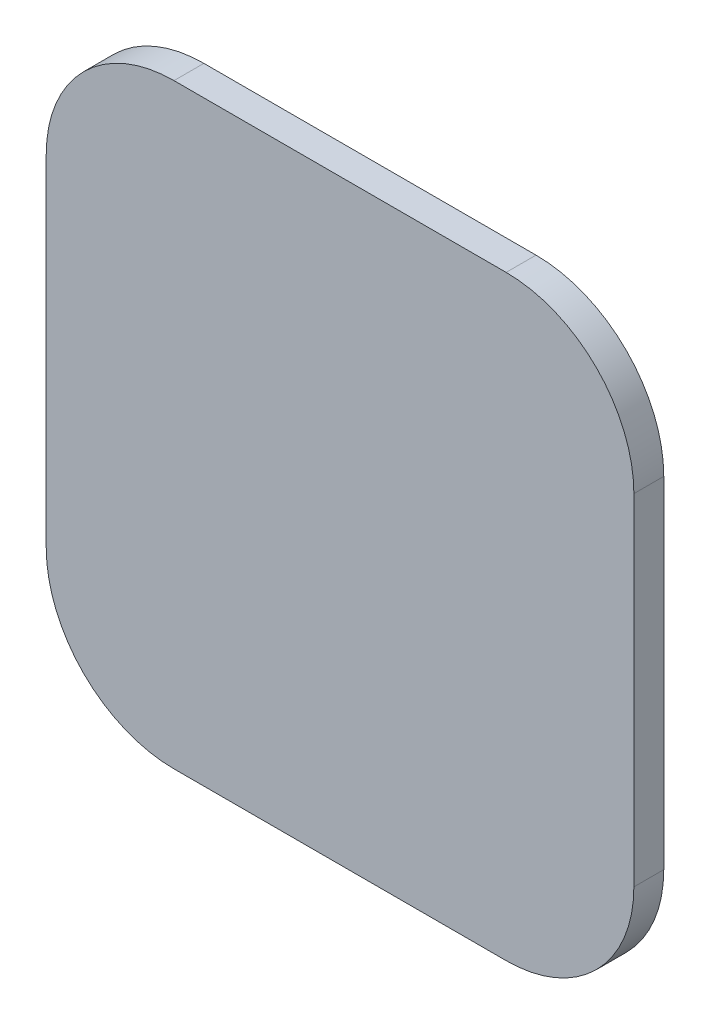
ISO-10303-21;
HEADER;
FILE_DESCRIPTION(('STEP AP214'),'2;1');
FILE_NAME('part.step','',(''),(''),'','','');
FILE_SCHEMA(('AUTOMOTIVE_DESIGN { 1 0 10303 214 1 1 1 1 }'));
ENDSEC;
DATA;
#1=APPLICATION_CONTEXT('core data for automotive mechanical design processes');
#2=APPLICATION_PROTOCOL_DEFINITION('international standard','automotive_design',2000,#1);
#3=PRODUCT_CONTEXT('',#1,'mechanical');
#4=PRODUCT('Part','Part','',(#3));
#5=PRODUCT_RELATED_PRODUCT_CATEGORY('part','',(#4));
#6=PRODUCT_DEFINITION_FORMATION('','',#4);
#7=PRODUCT_DEFINITION_CONTEXT('part definition',#1,'design');
#8=PRODUCT_DEFINITION('design','',#6,#7);
#9=PRODUCT_DEFINITION_SHAPE('','',#8);
#10=(LENGTH_UNIT() NAMED_UNIT(*) SI_UNIT(.MILLI.,.METRE.));
#11=(NAMED_UNIT(*) PLANE_ANGLE_UNIT() SI_UNIT($,.RADIAN.));
#12=(NAMED_UNIT(*) SI_UNIT($,.STERADIAN.) SOLID_ANGLE_UNIT());
#13=UNCERTAINTY_MEASURE_WITH_UNIT(LENGTH_MEASURE(1.E-05),#10,'distance_accuracy_value','');
#14=(GEOMETRIC_REPRESENTATION_CONTEXT(3) GLOBAL_UNCERTAINTY_ASSIGNED_CONTEXT((#13)) GLOBAL_UNIT_ASSIGNED_CONTEXT((#10,
#11,#12)) REPRESENTATION_CONTEXT('',''));
#15=CARTESIAN_POINT('',(0.,0.,0.));
#16=DIRECTION('',(0.,0.,1.));
#17=DIRECTION('',(1.,0.,0.));
#18=AXIS2_PLACEMENT_3D('',#15,#16,#17);
#19=CARTESIAN_POINT('',(0.,0.,-1.17));
#20=DIRECTION('',(-1.,0.,0.));
#21=DIRECTION('',(0.,0.,1.));
#22=AXIS2_PLACEMENT_3D('',#19,#20,#21);
#23=PLANE('',#22);
#24=DIRECTION('',(0.,-1.,0.));
#25=VECTOR('',#24,1.);
#26=CARTESIAN_POINT('',(0.,0.,0.));
#27=LINE('',#26,#25);
#28=CARTESIAN_POINT('',(0.,18.33,0.));
#29=VERTEX_POINT('',#28);
#30=CARTESIAN_POINT('',(0.,5.,0.));
#31=VERTEX_POINT('',#30);
#32=EDGE_CURVE('E162',#29,#31,#27,.T.);
#33=ORIENTED_EDGE('',*,*,#32,.F.);
#34=DIRECTION('',(0.,0.,1.));
#35=VECTOR('',#34,1.);
#36=CARTESIAN_POINT('',(0.,18.33,-1.17));
#37=LINE('',#36,#35);
#38=CARTESIAN_POINT('',(0.,18.33,-1.17));
#39=VERTEX_POINT('',#38);
#40=EDGE_CURVE('E142',#29,#39,#37,.F.);
#41=ORIENTED_EDGE('',*,*,#40,.T.);
#42=DIRECTION('',(0.,-1.,0.));
#43=VECTOR('',#42,1.);
#44=CARTESIAN_POINT('',(0.,0.,-1.17));
#45=LINE('',#44,#43);
#46=CARTESIAN_POINT('',(0.,5.,-1.17));
#47=VERTEX_POINT('',#46);
#48=EDGE_CURVE('E123',#39,#47,#45,.T.);
#49=ORIENTED_EDGE('',*,*,#48,.T.);
#50=DIRECTION('',(0.,0.,1.));
#51=VECTOR('',#50,1.);
#52=CARTESIAN_POINT('',(0.,5.,-1.17));
#53=LINE('',#52,#51);
#54=EDGE_CURVE('E139',#47,#31,#53,.T.);
#55=ORIENTED_EDGE('',*,*,#54,.T.);
#56=EDGE_LOOP('',(#33,#41,#49,#55));
#57=FACE_BOUND('',#56,.T.);
#58=ADVANCED_FACE('F37',(#57),#23,.T.);
#59=CARTESIAN_POINT('',(0.,23.33,-1.17));
#60=DIRECTION('',(0.,1.,0.));
#61=DIRECTION('',(-1.,0.,0.));
#62=AXIS2_PLACEMENT_3D('',#59,#60,#61);
#63=PLANE('',#62);
#64=DIRECTION('',(-1.,0.,0.));
#65=VECTOR('',#64,1.);
#66=CARTESIAN_POINT('',(0.,23.33,-1.17));
#67=LINE('',#66,#65);
#68=CARTESIAN_POINT('',(18.,23.33,-1.17));
#69=VERTEX_POINT('',#68);
#70=CARTESIAN_POINT('',(5.,23.33,-1.17));
#71=VERTEX_POINT('',#70);
#72=EDGE_CURVE('E127',#69,#71,#67,.T.);
#73=ORIENTED_EDGE('',*,*,#72,.T.);
#74=DIRECTION('',(0.,0.,1.));
#75=VECTOR('',#74,1.);
#76=CARTESIAN_POINT('',(5.,23.33,-1.17));
#77=LINE('',#76,#75);
#78=CARTESIAN_POINT('',(5.,23.33,0.));
#79=VERTEX_POINT('',#78);
#80=EDGE_CURVE('E114',#71,#79,#77,.T.);
#81=ORIENTED_EDGE('',*,*,#80,.T.);
#82=DIRECTION('',(-1.,0.,0.));
#83=VECTOR('',#82,1.);
#84=CARTESIAN_POINT('',(0.,23.33,0.));
#85=LINE('',#84,#83);
#86=CARTESIAN_POINT('',(18.,23.33,0.));
#87=VERTEX_POINT('',#86);
#88=EDGE_CURVE('E106',#87,#79,#85,.T.);
#89=ORIENTED_EDGE('',*,*,#88,.F.);
#90=DIRECTION('',(0.,0.,1.));
#91=VECTOR('',#90,1.);
#92=CARTESIAN_POINT('',(18.,23.33,-1.17));
#93=LINE('',#92,#91);
#94=EDGE_CURVE('E120',#87,#69,#93,.F.);
#95=ORIENTED_EDGE('',*,*,#94,.T.);
#96=EDGE_LOOP('',(#73,#81,#89,#95));
#97=FACE_BOUND('',#96,.T.);
#98=ADVANCED_FACE('F119',(#97),#63,.T.);
#99=CARTESIAN_POINT('',(23.,0.,-1.17));
#100=DIRECTION('',(1.,0.,0.));
#101=DIRECTION('',(0.,0.,-1.));
#102=AXIS2_PLACEMENT_3D('',#99,#100,#101);
#103=PLANE('',#102);
#104=DIRECTION('',(0.,1.,0.));
#105=VECTOR('',#104,1.);
#106=CARTESIAN_POINT('',(23.,0.,0.));
#107=LINE('',#106,#105);
#108=CARTESIAN_POINT('',(23.,5.,0.));
#109=VERTEX_POINT('',#108);
#110=CARTESIAN_POINT('',(23.,18.33,0.));
#111=VERTEX_POINT('',#110);
#112=EDGE_CURVE('E108',#109,#111,#107,.T.);
#113=ORIENTED_EDGE('',*,*,#112,.F.);
#114=DIRECTION('',(0.,0.,1.));
#115=VECTOR('',#114,1.);
#116=CARTESIAN_POINT('',(23.,5.,-1.17));
#117=LINE('',#116,#115);
#118=CARTESIAN_POINT('',(23.,5.,-1.17));
#119=VERTEX_POINT('',#118);
#120=EDGE_CURVE('E11',#109,#119,#117,.F.);
#121=ORIENTED_EDGE('',*,*,#120,.T.);
#122=DIRECTION('',(0.,1.,0.));
#123=VECTOR('',#122,1.);
#124=CARTESIAN_POINT('',(23.,0.,-1.17));
#125=LINE('',#124,#123);
#126=CARTESIAN_POINT('',(23.,18.33,-1.17));
#127=VERTEX_POINT('',#126);
#128=EDGE_CURVE('E130',#119,#127,#125,.T.);
#129=ORIENTED_EDGE('',*,*,#128,.T.);
#130=DIRECTION('',(0.,0.,1.));
#131=VECTOR('',#130,1.);
#132=CARTESIAN_POINT('',(23.,18.33,-1.17));
#133=LINE('',#132,#131);
#134=EDGE_CURVE('E45',#127,#111,#133,.T.);
#135=ORIENTED_EDGE('',*,*,#134,.T.);
#136=EDGE_LOOP('',(#113,#121,#129,#135));
#137=FACE_BOUND('',#136,.T.);
#138=ADVANCED_FACE('F155',(#137),#103,.T.);
#139=CARTESIAN_POINT('',(0.,0.,-1.17));
#140=DIRECTION('',(0.,-1.,0.));
#141=DIRECTION('',(0.,0.,-1.));
#142=AXIS2_PLACEMENT_3D('',#139,#140,#141);
#143=PLANE('',#142);
#144=DIRECTION('',(1.,0.,0.));
#145=VECTOR('',#144,1.);
#146=CARTESIAN_POINT('',(0.,0.,0.));
#147=LINE('',#146,#145);
#148=CARTESIAN_POINT('',(5.,0.,0.));
#149=VERTEX_POINT('',#148);
#150=CARTESIAN_POINT('',(18.,0.,0.));
#151=VERTEX_POINT('',#150);
#152=EDGE_CURVE('E165',#149,#151,#147,.T.);
#153=ORIENTED_EDGE('',*,*,#152,.F.);
#154=DIRECTION('',(0.,0.,1.));
#155=VECTOR('',#154,1.);
#156=CARTESIAN_POINT('',(5.,0.,-1.17));
#157=LINE('',#156,#155);
#158=CARTESIAN_POINT('',(5.,0.,-1.17));
#159=VERTEX_POINT('',#158);
#160=EDGE_CURVE('E59',#149,#159,#157,.F.);
#161=ORIENTED_EDGE('',*,*,#160,.T.);
#162=DIRECTION('',(1.,0.,0.));
#163=VECTOR('',#162,1.);
#164=CARTESIAN_POINT('',(0.,0.,-1.17));
#165=LINE('',#164,#163);
#166=CARTESIAN_POINT('',(18.,0.,-1.17));
#167=VERTEX_POINT('',#166);
#168=EDGE_CURVE('E157',#159,#167,#165,.T.);
#169=ORIENTED_EDGE('',*,*,#168,.T.);
#170=DIRECTION('',(0.,0.,1.));
#171=VECTOR('',#170,1.);
#172=CARTESIAN_POINT('',(18.,0.,-1.17));
#173=LINE('',#172,#171);
#174=EDGE_CURVE('E150',#167,#151,#173,.T.);
#175=ORIENTED_EDGE('',*,*,#174,.T.);
#176=EDGE_LOOP('',(#153,#161,#169,#175));
#177=FACE_BOUND('',#176,.T.);
#178=ADVANCED_FACE('F167',(#177),#143,.T.);
#179=CARTESIAN_POINT('',(0.,0.,-1.17));
#180=DIRECTION('',(0.,0.,-1.));
#181=DIRECTION('',(-1.,0.,0.));
#182=AXIS2_PLACEMENT_3D('',#179,#180,#181);
#183=PLANE('',#182);
#184=ORIENTED_EDGE('',*,*,#48,.F.);
#185=CARTESIAN_POINT('',(5.,18.33,-1.17));
#186=DIRECTION('',(0.,0.,-1.));
#187=DIRECTION('',(-1.,0.,0.));
#188=AXIS2_PLACEMENT_3D('',#185,#186,#187);
#189=CIRCLE('',#188,5.);
#190=EDGE_CURVE('E148',#39,#71,#189,.T.);
#191=ORIENTED_EDGE('',*,*,#190,.T.);
#192=ORIENTED_EDGE('',*,*,#72,.F.);
#193=CARTESIAN_POINT('',(18.,18.33,-1.17));
#194=DIRECTION('',(0.,0.,-1.));
#195=DIRECTION('',(-1.,0.,0.));
#196=AXIS2_PLACEMENT_3D('',#193,#194,#195);
#197=CIRCLE('',#196,5.);
#198=EDGE_CURVE('E126',#69,#127,#197,.T.);
#199=ORIENTED_EDGE('',*,*,#198,.T.);
#200=ORIENTED_EDGE('',*,*,#128,.F.);
#201=CARTESIAN_POINT('',(18.,5.,-1.17));
#202=DIRECTION('',(0.,0.,-1.));
#203=DIRECTION('',(-1.,0.,0.));
#204=AXIS2_PLACEMENT_3D('',#201,#202,#203);
#205=CIRCLE('',#204,5.);
#206=EDGE_CURVE('E52',#119,#167,#205,.T.);
#207=ORIENTED_EDGE('',*,*,#206,.T.);
#208=ORIENTED_EDGE('',*,*,#168,.F.);
#209=CARTESIAN_POINT('',(5.,5.,-1.17));
#210=DIRECTION('',(0.,0.,-1.));
#211=DIRECTION('',(-1.,0.,0.));
#212=AXIS2_PLACEMENT_3D('',#209,#210,#211);
#213=CIRCLE('',#212,5.);
#214=EDGE_CURVE('E146',#159,#47,#213,.T.);
#215=ORIENTED_EDGE('',*,*,#214,.T.);
#216=EDGE_LOOP('',(#184,#191,#192,#199,#200,#207,#208,#215));
#217=FACE_BOUND('',#216,.T.);
#218=ADVANCED_FACE('F175',(#217),#183,.T.);
#219=CARTESIAN_POINT('',(0.,0.,0.));
#220=DIRECTION('',(0.,0.,-1.));
#221=DIRECTION('',(-1.,0.,0.));
#222=AXIS2_PLACEMENT_3D('',#219,#220,#221);
#223=PLANE('',#222);
#224=ORIENTED_EDGE('',*,*,#88,.T.);
#225=CARTESIAN_POINT('',(5.,18.33,0.));
#226=DIRECTION('',(0.,0.,-1.));
#227=DIRECTION('',(-1.,0.,0.));
#228=AXIS2_PLACEMENT_3D('',#225,#226,#227);
#229=CIRCLE('',#228,5.);
#230=EDGE_CURVE('E137',#79,#29,#229,.F.);
#231=ORIENTED_EDGE('',*,*,#230,.T.);
#232=ORIENTED_EDGE('',*,*,#32,.T.);
#233=CARTESIAN_POINT('',(5.,5.,0.));
#234=DIRECTION('',(0.,0.,-1.));
#235=DIRECTION('',(-1.,0.,0.));
#236=AXIS2_PLACEMENT_3D('',#233,#234,#235);
#237=CIRCLE('',#236,5.);
#238=EDGE_CURVE('E135',#31,#149,#237,.F.);
#239=ORIENTED_EDGE('',*,*,#238,.T.);
#240=ORIENTED_EDGE('',*,*,#152,.T.);
#241=CARTESIAN_POINT('',(18.,5.,0.));
#242=DIRECTION('',(0.,0.,-1.));
#243=DIRECTION('',(-1.,0.,0.));
#244=AXIS2_PLACEMENT_3D('',#241,#242,#243);
#245=CIRCLE('',#244,5.);
#246=EDGE_CURVE('E113',#151,#109,#245,.F.);
#247=ORIENTED_EDGE('',*,*,#246,.T.);
#248=ORIENTED_EDGE('',*,*,#112,.T.);
#249=CARTESIAN_POINT('',(18.,18.33,0.));
#250=DIRECTION('',(0.,0.,-1.));
#251=DIRECTION('',(-1.,0.,0.));
#252=AXIS2_PLACEMENT_3D('',#249,#250,#251);
#253=CIRCLE('',#252,5.);
#254=EDGE_CURVE('E103',#111,#87,#253,.F.);
#255=ORIENTED_EDGE('',*,*,#254,.T.);
#256=EDGE_LOOP('',(#224,#231,#232,#239,#240,#247,#248,#255));
#257=FACE_BOUND('',#256,.T.);
#258=ADVANCED_FACE('F105',(#257),#223,.F.);
#259=CARTESIAN_POINT('',(5.,18.33,-1.17));
#260=DIRECTION('',(0.,0.,1.));
#261=DIRECTION('',(1.,0.,0.));
#262=AXIS2_PLACEMENT_3D('',#259,#260,#261);
#263=CYLINDRICAL_SURFACE('',#262,5.);
#264=ORIENTED_EDGE('',*,*,#190,.F.);
#265=ORIENTED_EDGE('',*,*,#40,.F.);
#266=ORIENTED_EDGE('',*,*,#230,.F.);
#267=ORIENTED_EDGE('',*,*,#80,.F.);
#268=EDGE_LOOP('',(#264,#265,#266,#267));
#269=FACE_BOUND('',#268,.T.);
#270=ADVANCED_FACE('F181',(#269),#263,.T.);
#271=CARTESIAN_POINT('',(5.,5.,-1.17));
#272=DIRECTION('',(0.,0.,1.));
#273=DIRECTION('',(1.,0.,0.));
#274=AXIS2_PLACEMENT_3D('',#271,#272,#273);
#275=CYLINDRICAL_SURFACE('',#274,5.);
#276=ORIENTED_EDGE('',*,*,#214,.F.);
#277=ORIENTED_EDGE('',*,*,#160,.F.);
#278=ORIENTED_EDGE('',*,*,#238,.F.);
#279=ORIENTED_EDGE('',*,*,#54,.F.);
#280=EDGE_LOOP('',(#276,#277,#278,#279));
#281=FACE_BOUND('',#280,.T.);
#282=ADVANCED_FACE('F171',(#281),#275,.T.);
#283=CARTESIAN_POINT('',(18.,5.,-1.17));
#284=DIRECTION('',(0.,0.,1.));
#285=DIRECTION('',(1.,0.,0.));
#286=AXIS2_PLACEMENT_3D('',#283,#284,#285);
#287=CYLINDRICAL_SURFACE('',#286,5.);
#288=ORIENTED_EDGE('',*,*,#206,.F.);
#289=ORIENTED_EDGE('',*,*,#120,.F.);
#290=ORIENTED_EDGE('',*,*,#246,.F.);
#291=ORIENTED_EDGE('',*,*,#174,.F.);
#292=EDGE_LOOP('',(#288,#289,#290,#291));
#293=FACE_BOUND('',#292,.T.);
#294=ADVANCED_FACE('F188',(#293),#287,.T.);
#295=CARTESIAN_POINT('',(18.,18.33,-1.17));
#296=DIRECTION('',(0.,0.,1.));
#297=DIRECTION('',(1.,0.,0.));
#298=AXIS2_PLACEMENT_3D('',#295,#296,#297);
#299=CYLINDRICAL_SURFACE('',#298,5.);
#300=ORIENTED_EDGE('',*,*,#198,.F.);
#301=ORIENTED_EDGE('',*,*,#94,.F.);
#302=ORIENTED_EDGE('',*,*,#254,.F.);
#303=ORIENTED_EDGE('',*,*,#134,.F.);
#304=EDGE_LOOP('',(#300,#301,#302,#303));
#305=FACE_BOUND('',#304,.T.);
#306=ADVANCED_FACE('F39',(#305),#299,.T.);
#307=CLOSED_SHELL('',(#58,#98,#138,#178,#218,#258,#270,#282,#294,#306));
#308=MANIFOLD_SOLID_BREP('B2',#307);
#309=ADVANCED_BREP_SHAPE_REPRESENTATION('',(#18,#308),#14);
#310=SHAPE_DEFINITION_REPRESENTATION(#9,#309);
ENDSEC;
END-ISO-10303-21;
